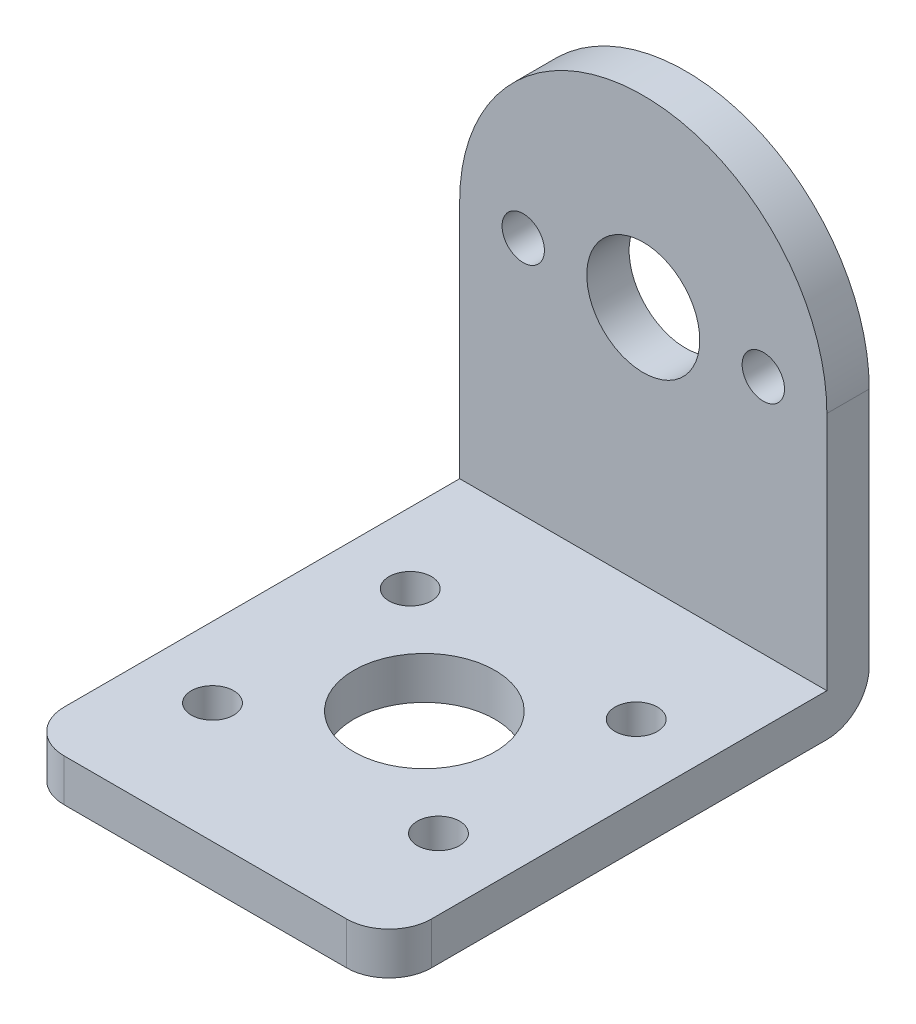
ISO-10303-21;
HEADER;
FILE_DESCRIPTION(('STEP AP214'),'2;1');
FILE_NAME('part.step','',(''),(''),'','','');
FILE_SCHEMA(('AUTOMOTIVE_DESIGN { 1 0 10303 214 1 1 1 1 }'));
ENDSEC;
DATA;
#1=APPLICATION_CONTEXT('core data for automotive mechanical design processes');
#2=APPLICATION_PROTOCOL_DEFINITION('international standard','automotive_design',2000,#1);
#3=PRODUCT_CONTEXT('',#1,'mechanical');
#4=PRODUCT('Part','Part','',(#3));
#5=PRODUCT_RELATED_PRODUCT_CATEGORY('part','',(#4));
#6=PRODUCT_DEFINITION_FORMATION('','',#4);
#7=PRODUCT_DEFINITION_CONTEXT('part definition',#1,'design');
#8=PRODUCT_DEFINITION('design','',#6,#7);
#9=PRODUCT_DEFINITION_SHAPE('','',#8);
#10=(LENGTH_UNIT() NAMED_UNIT(*) SI_UNIT(.MILLI.,.METRE.));
#11=(NAMED_UNIT(*) PLANE_ANGLE_UNIT() SI_UNIT($,.RADIAN.));
#12=(NAMED_UNIT(*) SI_UNIT($,.STERADIAN.) SOLID_ANGLE_UNIT());
#13=UNCERTAINTY_MEASURE_WITH_UNIT(LENGTH_MEASURE(1.E-05),#10,'distance_accuracy_value','');
#14=(GEOMETRIC_REPRESENTATION_CONTEXT(3) GLOBAL_UNCERTAINTY_ASSIGNED_CONTEXT((#13)) GLOBAL_UNIT_ASSIGNED_CONTEXT((#10,
#11,#12)) REPRESENTATION_CONTEXT('',''));
#15=CARTESIAN_POINT('',(0.,0.,0.));
#16=DIRECTION('',(0.,0.,1.));
#17=DIRECTION('',(1.,0.,0.));
#18=AXIS2_PLACEMENT_3D('',#15,#16,#17);
#19=CARTESIAN_POINT('',(0.,20.,3.));
#20=DIRECTION('',(0.,0.,1.));
#21=DIRECTION('',(1.,0.,0.));
#22=AXIS2_PLACEMENT_3D('',#19,#20,#21);
#23=PLANE('',#22);
#24=DIRECTION('',(-1.,0.,0.));
#25=VECTOR('',#24,1.);
#26=CARTESIAN_POINT('',(13.,3.,3.));
#27=LINE('',#26,#25);
#28=CARTESIAN_POINT('',(13.,3.,3.));
#29=VERTEX_POINT('',#28);
#30=CARTESIAN_POINT('',(-13.,3.,3.));
#31=VERTEX_POINT('',#30);
#32=EDGE_CURVE('E128',#29,#31,#27,.T.);
#33=ORIENTED_EDGE('',*,*,#32,.F.);
#34=DIRECTION('',(0.,1.,0.));
#35=VECTOR('',#34,1.);
#36=CARTESIAN_POINT('',(13.,0.,3.));
#37=LINE('',#36,#35);
#38=CARTESIAN_POINT('',(13.,20.,3.));
#39=VERTEX_POINT('',#38);
#40=EDGE_CURVE('E134',#29,#39,#37,.T.);
#41=ORIENTED_EDGE('',*,*,#40,.T.);
#42=CARTESIAN_POINT('',(0.,20.,3.));
#43=DIRECTION('',(0.,0.,1.));
#44=DIRECTION('',(1.,0.,0.));
#45=AXIS2_PLACEMENT_3D('',#42,#43,#44);
#46=CIRCLE('',#45,13.);
#47=CARTESIAN_POINT('',(-13.,20.,3.));
#48=VERTEX_POINT('',#47);
#49=EDGE_CURVE('E131',#39,#48,#46,.T.);
#50=ORIENTED_EDGE('',*,*,#49,.T.);
#51=DIRECTION('',(0.,-1.,0.));
#52=VECTOR('',#51,1.);
#53=CARTESIAN_POINT('',(-13.,20.,3.));
#54=LINE('',#53,#52);
#55=EDGE_CURVE('E114',#48,#31,#54,.T.);
#56=ORIENTED_EDGE('',*,*,#55,.T.);
#57=EDGE_LOOP('',(#33,#41,#50,#56));
#58=FACE_BOUND('',#57,.T.);
#59=CARTESIAN_POINT('',(-8.5,20.,3.));
#60=DIRECTION('',(0.,0.,1.));
#61=DIRECTION('',(1.,0.,0.));
#62=AXIS2_PLACEMENT_3D('',#59,#60,#61);
#63=CIRCLE('',#62,1.5);
#64=CARTESIAN_POINT('',(-7.,20.,3.));
#65=VERTEX_POINT('',#64);
#66=EDGE_CURVE('E163',#65,#65,#63,.T.);
#67=ORIENTED_EDGE('',*,*,#66,.F.);
#68=EDGE_LOOP('',(#67));
#69=FACE_BOUND('',#68,.T.);
#70=CARTESIAN_POINT('',(0.,20.,3.));
#71=DIRECTION('',(0.,0.,1.));
#72=DIRECTION('',(1.,0.,0.));
#73=AXIS2_PLACEMENT_3D('',#70,#71,#72);
#74=CIRCLE('',#73,4.);
#75=CARTESIAN_POINT('',(4.,20.,3.));
#76=VERTEX_POINT('',#75);
#77=EDGE_CURVE('E171',#76,#76,#74,.T.);
#78=ORIENTED_EDGE('',*,*,#77,.F.);
#79=EDGE_LOOP('',(#78));
#80=FACE_BOUND('',#79,.T.);
#81=CARTESIAN_POINT('',(8.5,20.,3.));
#82=DIRECTION('',(0.,0.,1.));
#83=DIRECTION('',(1.,0.,0.));
#84=AXIS2_PLACEMENT_3D('',#81,#82,#83);
#85=CIRCLE('',#84,1.5);
#86=CARTESIAN_POINT('',(10.,20.,3.));
#87=VERTEX_POINT('',#86);
#88=EDGE_CURVE('E155',#87,#87,#85,.T.);
#89=ORIENTED_EDGE('',*,*,#88,.F.);
#90=EDGE_LOOP('',(#89));
#91=FACE_BOUND('',#90,.T.);
#92=ADVANCED_FACE('F39',(#58,#69,#80,#91),#23,.T.);
#93=CARTESIAN_POINT('',(0.,20.,0.));
#94=DIRECTION('',(0.,0.,1.));
#95=DIRECTION('',(1.,0.,0.));
#96=AXIS2_PLACEMENT_3D('',#93,#94,#95);
#97=PLANE('',#96);
#98=DIRECTION('',(0.,1.,0.));
#99=VECTOR('',#98,1.);
#100=CARTESIAN_POINT('',(13.,0.,0.));
#101=LINE('',#100,#99);
#102=CARTESIAN_POINT('',(13.,3.,0.));
#103=VERTEX_POINT('',#102);
#104=CARTESIAN_POINT('',(13.,20.,0.));
#105=VERTEX_POINT('',#104);
#106=EDGE_CURVE('E186',#103,#105,#101,.T.);
#107=ORIENTED_EDGE('',*,*,#106,.F.);
#108=DIRECTION('',(1.,0.,0.));
#109=VECTOR('',#108,1.);
#110=CARTESIAN_POINT('',(0.,3.,0.));
#111=LINE('',#110,#109);
#112=CARTESIAN_POINT('',(-13.,3.00000000000001,0.));
#113=VERTEX_POINT('',#112);
#114=EDGE_CURVE('E48',#103,#113,#111,.F.);
#115=ORIENTED_EDGE('',*,*,#114,.T.);
#116=DIRECTION('',(0.,-1.,0.));
#117=VECTOR('',#116,1.);
#118=CARTESIAN_POINT('',(-13.,20.,0.));
#119=LINE('',#118,#117);
#120=CARTESIAN_POINT('',(-13.,20.,0.));
#121=VERTEX_POINT('',#120);
#122=EDGE_CURVE('E175',#121,#113,#119,.T.);
#123=ORIENTED_EDGE('',*,*,#122,.F.);
#124=CARTESIAN_POINT('',(0.,20.,0.));
#125=DIRECTION('',(0.,0.,1.));
#126=DIRECTION('',(1.,0.,0.));
#127=AXIS2_PLACEMENT_3D('',#124,#125,#126);
#128=CIRCLE('',#127,13.);
#129=EDGE_CURVE('E135',#105,#121,#128,.T.);
#130=ORIENTED_EDGE('',*,*,#129,.F.);
#131=EDGE_LOOP('',(#107,#115,#123,#130));
#132=FACE_BOUND('',#131,.T.);
#133=CARTESIAN_POINT('',(0.,20.,0.));
#134=DIRECTION('',(0.,0.,1.));
#135=DIRECTION('',(1.,0.,0.));
#136=AXIS2_PLACEMENT_3D('',#133,#134,#135);
#137=CIRCLE('',#136,4.);
#138=CARTESIAN_POINT('',(4.,20.,0.));
#139=VERTEX_POINT('',#138);
#140=EDGE_CURVE('E167',#139,#139,#137,.T.);
#141=ORIENTED_EDGE('',*,*,#140,.T.);
#142=EDGE_LOOP('',(#141));
#143=FACE_BOUND('',#142,.T.);
#144=CARTESIAN_POINT('',(-8.5,20.,0.));
#145=DIRECTION('',(0.,0.,1.));
#146=DIRECTION('',(1.,0.,0.));
#147=AXIS2_PLACEMENT_3D('',#144,#145,#146);
#148=CIRCLE('',#147,1.5);
#149=CARTESIAN_POINT('',(-7.,20.,0.));
#150=VERTEX_POINT('',#149);
#151=EDGE_CURVE('E159',#150,#150,#148,.T.);
#152=ORIENTED_EDGE('',*,*,#151,.T.);
#153=EDGE_LOOP('',(#152));
#154=FACE_BOUND('',#153,.T.);
#155=CARTESIAN_POINT('',(8.5,20.,0.));
#156=DIRECTION('',(0.,0.,1.));
#157=DIRECTION('',(1.,0.,0.));
#158=AXIS2_PLACEMENT_3D('',#155,#156,#157);
#159=CIRCLE('',#158,1.5);
#160=CARTESIAN_POINT('',(10.,20.,0.));
#161=VERTEX_POINT('',#160);
#162=EDGE_CURVE('E154',#161,#161,#159,.T.);
#163=ORIENTED_EDGE('',*,*,#162,.T.);
#164=EDGE_LOOP('',(#163));
#165=FACE_BOUND('',#164,.T.);
#166=ADVANCED_FACE('F264',(#132,#143,#154,#165),#97,.F.);
#167=CARTESIAN_POINT('',(-13.,20.,3.));
#168=DIRECTION('',(1.,0.,0.));
#169=DIRECTION('',(0.,1.,0.));
#170=AXIS2_PLACEMENT_3D('',#167,#168,#169);
#171=PLANE('',#170);
#172=ORIENTED_EDGE('',*,*,#122,.T.);
#173=CARTESIAN_POINT('',(-13.,3.,3.));
#174=DIRECTION('',(1.,0.,0.));
#175=DIRECTION('',(0.,1.,0.));
#176=AXIS2_PLACEMENT_3D('',#173,#174,#175);
#177=CIRCLE('',#176,3.);
#178=CARTESIAN_POINT('',(-13.,0.,3.));
#179=VERTEX_POINT('',#178);
#180=EDGE_CURVE('E11',#113,#179,#177,.F.);
#181=ORIENTED_EDGE('',*,*,#180,.T.);
#182=DIRECTION('',(0.,0.,-1.));
#183=VECTOR('',#182,1.);
#184=CARTESIAN_POINT('',(-13.,0.,3.));
#185=LINE('',#184,#183);
#186=CARTESIAN_POINT('',(-13.,0.,31.));
#187=VERTEX_POINT('',#186);
#188=EDGE_CURVE('E200',#187,#179,#185,.T.);
#189=ORIENTED_EDGE('',*,*,#188,.F.);
#190=DIRECTION('',(0.,-1.,0.));
#191=VECTOR('',#190,1.);
#192=CARTESIAN_POINT('',(-13.,3.,31.));
#193=LINE('',#192,#191);
#194=CARTESIAN_POINT('',(-13.,3.,31.));
#195=VERTEX_POINT('',#194);
#196=EDGE_CURVE('E117',#187,#195,#193,.F.);
#197=ORIENTED_EDGE('',*,*,#196,.T.);
#198=DIRECTION('',(0.,0.,-1.));
#199=VECTOR('',#198,1.);
#200=CARTESIAN_POINT('',(-13.,3.,34.));
#201=LINE('',#200,#199);
#202=EDGE_CURVE('E110',#195,#31,#201,.T.);
#203=ORIENTED_EDGE('',*,*,#202,.T.);
#204=ORIENTED_EDGE('',*,*,#55,.F.);
#205=DIRECTION('',(0.,0.,-1.));
#206=VECTOR('',#205,1.);
#207=CARTESIAN_POINT('',(-13.,20.,3.));
#208=LINE('',#207,#206);
#209=EDGE_CURVE('E183',#48,#121,#208,.T.);
#210=ORIENTED_EDGE('',*,*,#209,.T.);
#211=EDGE_LOOP('',(#172,#181,#189,#197,#203,#204,#210));
#212=FACE_BOUND('',#211,.T.);
#213=ADVANCED_FACE('F112',(#212),#171,.F.);
#214=CARTESIAN_POINT('',(-13.,0.,3.));
#215=DIRECTION('',(0.,1.,0.));
#216=DIRECTION('',(-1.,0.,0.));
#217=AXIS2_PLACEMENT_3D('',#214,#215,#216);
#218=PLANE('',#217);
#219=CARTESIAN_POINT('',(-8.,0.,25.5));
#220=DIRECTION('',(0.,1.,0.));
#221=DIRECTION('',(-1.,0.,0.));
#222=AXIS2_PLACEMENT_3D('',#219,#220,#221);
#223=CIRCLE('',#222,1.5);
#224=CARTESIAN_POINT('',(-9.5,0.,25.5));
#225=VERTEX_POINT('',#224);
#226=EDGE_CURVE('E439',#225,#225,#223,.T.);
#227=ORIENTED_EDGE('',*,*,#226,.T.);
#228=EDGE_LOOP('',(#227));
#229=FACE_BOUND('',#228,.T.);
#230=CARTESIAN_POINT('',(8.,0.,25.5));
#231=DIRECTION('',(0.,1.,0.));
#232=DIRECTION('',(-1.,0.,0.));
#233=AXIS2_PLACEMENT_3D('',#230,#231,#232);
#234=CIRCLE('',#233,1.5);
#235=CARTESIAN_POINT('',(6.5,0.,25.5));
#236=VERTEX_POINT('',#235);
#237=EDGE_CURVE('E473',#236,#236,#234,.T.);
#238=ORIENTED_EDGE('',*,*,#237,.T.);
#239=EDGE_LOOP('',(#238));
#240=FACE_BOUND('',#239,.T.);
#241=CARTESIAN_POINT('',(8.,0.,11.5));
#242=DIRECTION('',(0.,1.,0.));
#243=DIRECTION('',(-1.,0.,0.));
#244=AXIS2_PLACEMENT_3D('',#241,#242,#243);
#245=CIRCLE('',#244,1.5);
#246=CARTESIAN_POINT('',(6.5,0.,11.5));
#247=VERTEX_POINT('',#246);
#248=EDGE_CURVE('E463',#247,#247,#245,.T.);
#249=ORIENTED_EDGE('',*,*,#248,.T.);
#250=EDGE_LOOP('',(#249));
#251=FACE_BOUND('',#250,.T.);
#252=CARTESIAN_POINT('',(-8.,0.,11.5));
#253=DIRECTION('',(0.,1.,0.));
#254=DIRECTION('',(-1.,0.,0.));
#255=AXIS2_PLACEMENT_3D('',#252,#253,#254);
#256=CIRCLE('',#255,1.5);
#257=CARTESIAN_POINT('',(-9.5,0.,11.5));
#258=VERTEX_POINT('',#257);
#259=EDGE_CURVE('E452',#258,#258,#256,.T.);
#260=ORIENTED_EDGE('',*,*,#259,.T.);
#261=EDGE_LOOP('',(#260));
#262=FACE_BOUND('',#261,.T.);
#263=CARTESIAN_POINT('',(0.,0.,18.5));
#264=DIRECTION('',(0.,1.,0.));
#265=DIRECTION('',(-1.,0.,0.));
#266=AXIS2_PLACEMENT_3D('',#263,#264,#265);
#267=CIRCLE('',#266,5.);
#268=CARTESIAN_POINT('',(-5.,0.,18.5));
#269=VERTEX_POINT('',#268);
#270=EDGE_CURVE('E141',#269,#269,#267,.T.);
#271=ORIENTED_EDGE('',*,*,#270,.T.);
#272=EDGE_LOOP('',(#271));
#273=FACE_BOUND('',#272,.T.);
#274=ORIENTED_EDGE('',*,*,#188,.T.);
#275=DIRECTION('',(1.,0.,0.));
#276=VECTOR('',#275,1.);
#277=CARTESIAN_POINT('',(-13.,0.,3.));
#278=LINE('',#277,#276);
#279=CARTESIAN_POINT('',(13.,0.,3.));
#280=VERTEX_POINT('',#279);
#281=EDGE_CURVE('E229',#179,#280,#278,.T.);
#282=ORIENTED_EDGE('',*,*,#281,.T.);
#283=DIRECTION('',(0.,0.,-1.));
#284=VECTOR('',#283,1.);
#285=CARTESIAN_POINT('',(13.,0.,3.));
#286=LINE('',#285,#284);
#287=CARTESIAN_POINT('',(13.,0.,31.));
#288=VERTEX_POINT('',#287);
#289=EDGE_CURVE('E197',#288,#280,#286,.T.);
#290=ORIENTED_EDGE('',*,*,#289,.F.);
#291=CARTESIAN_POINT('',(10.,0.,31.));
#292=DIRECTION('',(0.,1.,0.));
#293=DIRECTION('',(-1.,0.,0.));
#294=AXIS2_PLACEMENT_3D('',#291,#292,#293);
#295=CIRCLE('',#294,3.);
#296=CARTESIAN_POINT('',(9.99999999999999,0.,34.));
#297=VERTEX_POINT('',#296);
#298=EDGE_CURVE('E212',#288,#297,#295,.F.);
#299=ORIENTED_EDGE('',*,*,#298,.T.);
#300=DIRECTION('',(1.,0.,0.));
#301=VECTOR('',#300,1.);
#302=CARTESIAN_POINT('',(-13.,0.,34.));
#303=LINE('',#302,#301);
#304=CARTESIAN_POINT('',(-10.,0.,34.));
#305=VERTEX_POINT('',#304);
#306=EDGE_CURVE('E140',#305,#297,#303,.T.);
#307=ORIENTED_EDGE('',*,*,#306,.F.);
#308=CARTESIAN_POINT('',(-10.,0.,31.));
#309=DIRECTION('',(0.,1.,0.));
#310=DIRECTION('',(-1.,0.,0.));
#311=AXIS2_PLACEMENT_3D('',#308,#309,#310);
#312=CIRCLE('',#311,3.);
#313=EDGE_CURVE('E215',#305,#187,#312,.F.);
#314=ORIENTED_EDGE('',*,*,#313,.T.);
#315=EDGE_LOOP('',(#274,#282,#290,#299,#307,#314));
#316=FACE_BOUND('',#315,.T.);
#317=ADVANCED_FACE('F246',(#229,#240,#251,#262,#273,#316),#218,.F.);
#318=CARTESIAN_POINT('',(13.,0.,3.));
#319=DIRECTION('',(-1.,0.,0.));
#320=DIRECTION('',(0.,-1.,0.));
#321=AXIS2_PLACEMENT_3D('',#318,#319,#320);
#322=PLANE('',#321);
#323=ORIENTED_EDGE('',*,*,#289,.T.);
#324=CARTESIAN_POINT('',(13.,3.,3.));
#325=DIRECTION('',(-1.,0.,0.));
#326=DIRECTION('',(0.,-1.,0.));
#327=AXIS2_PLACEMENT_3D('',#324,#325,#326);
#328=CIRCLE('',#327,3.);
#329=EDGE_CURVE('E62',#280,#103,#328,.F.);
#330=ORIENTED_EDGE('',*,*,#329,.T.);
#331=ORIENTED_EDGE('',*,*,#106,.T.);
#332=DIRECTION('',(0.,0.,-1.));
#333=VECTOR('',#332,1.);
#334=CARTESIAN_POINT('',(13.,20.,3.));
#335=LINE('',#334,#333);
#336=EDGE_CURVE('E193',#39,#105,#335,.T.);
#337=ORIENTED_EDGE('',*,*,#336,.F.);
#338=ORIENTED_EDGE('',*,*,#40,.F.);
#339=DIRECTION('',(0.,0.,-1.));
#340=VECTOR('',#339,1.);
#341=CARTESIAN_POINT('',(13.,3.,34.));
#342=LINE('',#341,#340);
#343=CARTESIAN_POINT('',(13.,3.,31.));
#344=VERTEX_POINT('',#343);
#345=EDGE_CURVE('E122',#344,#29,#342,.T.);
#346=ORIENTED_EDGE('',*,*,#345,.F.);
#347=DIRECTION('',(0.,1.,0.));
#348=VECTOR('',#347,1.);
#349=CARTESIAN_POINT('',(13.,0.,31.));
#350=LINE('',#349,#348);
#351=EDGE_CURVE('E226',#344,#288,#350,.F.);
#352=ORIENTED_EDGE('',*,*,#351,.T.);
#353=EDGE_LOOP('',(#323,#330,#331,#337,#338,#346,#352));
#354=FACE_BOUND('',#353,.T.);
#355=ADVANCED_FACE('F252',(#354),#322,.F.);
#356=CARTESIAN_POINT('',(0.,20.,3.));
#357=DIRECTION('',(0.,0.,-1.));
#358=DIRECTION('',(-1.,0.,0.));
#359=AXIS2_PLACEMENT_3D('',#356,#357,#358);
#360=CYLINDRICAL_SURFACE('',#359,13.);
#361=ORIENTED_EDGE('',*,*,#129,.T.);
#362=ORIENTED_EDGE('',*,*,#209,.F.);
#363=ORIENTED_EDGE('',*,*,#49,.F.);
#364=ORIENTED_EDGE('',*,*,#336,.T.);
#365=EDGE_LOOP('',(#361,#362,#363,#364));
#366=FACE_BOUND('',#365,.T.);
#367=ADVANCED_FACE('F274',(#366),#360,.T.);
#368=CARTESIAN_POINT('',(0.,20.,3.));
#369=DIRECTION('',(0.,0.,-1.));
#370=DIRECTION('',(-1.,0.,0.));
#371=AXIS2_PLACEMENT_3D('',#368,#369,#370);
#372=CYLINDRICAL_SURFACE('',#371,4.);
#373=ORIENTED_EDGE('',*,*,#77,.T.);
#374=EDGE_LOOP('',(#373));
#375=FACE_BOUND('',#374,.T.);
#376=ORIENTED_EDGE('',*,*,#140,.F.);
#377=EDGE_LOOP('',(#376));
#378=FACE_BOUND('',#377,.T.);
#379=ADVANCED_FACE('F271',(#375,#378),#372,.F.);
#380=CARTESIAN_POINT('',(-8.5,20.,3.));
#381=DIRECTION('',(0.,0.,-1.));
#382=DIRECTION('',(-1.,0.,0.));
#383=AXIS2_PLACEMENT_3D('',#380,#381,#382);
#384=CYLINDRICAL_SURFACE('',#383,1.5);
#385=ORIENTED_EDGE('',*,*,#66,.T.);
#386=EDGE_LOOP('',(#385));
#387=FACE_BOUND('',#386,.T.);
#388=ORIENTED_EDGE('',*,*,#151,.F.);
#389=EDGE_LOOP('',(#388));
#390=FACE_BOUND('',#389,.T.);
#391=ADVANCED_FACE('F307',(#387,#390),#384,.F.);
#392=CARTESIAN_POINT('',(8.5,20.,3.));
#393=DIRECTION('',(0.,0.,-1.));
#394=DIRECTION('',(-1.,0.,0.));
#395=AXIS2_PLACEMENT_3D('',#392,#393,#394);
#396=CYLINDRICAL_SURFACE('',#395,1.5);
#397=ORIENTED_EDGE('',*,*,#88,.T.);
#398=EDGE_LOOP('',(#397));
#399=FACE_BOUND('',#398,.T.);
#400=ORIENTED_EDGE('',*,*,#162,.F.);
#401=EDGE_LOOP('',(#400));
#402=FACE_BOUND('',#401,.T.);
#403=ADVANCED_FACE('F314',(#399,#402),#396,.F.);
#404=CARTESIAN_POINT('',(13.,3.,34.));
#405=DIRECTION('',(0.,-1.,0.));
#406=DIRECTION('',(1.,0.,0.));
#407=AXIS2_PLACEMENT_3D('',#404,#405,#406);
#408=PLANE('',#407);
#409=CARTESIAN_POINT('',(-8.,3.,25.5));
#410=DIRECTION('',(0.,1.,0.));
#411=DIRECTION('',(-1.,0.,0.));
#412=AXIS2_PLACEMENT_3D('',#409,#410,#411);
#413=CIRCLE('',#412,1.5);
#414=CARTESIAN_POINT('',(-9.5,3.,25.5));
#415=VERTEX_POINT('',#414);
#416=EDGE_CURVE('E442',#415,#415,#413,.T.);
#417=ORIENTED_EDGE('',*,*,#416,.F.);
#418=EDGE_LOOP('',(#417));
#419=FACE_BOUND('',#418,.T.);
#420=CARTESIAN_POINT('',(8.,3.,25.5));
#421=DIRECTION('',(0.,1.,0.));
#422=DIRECTION('',(-1.,0.,0.));
#423=AXIS2_PLACEMENT_3D('',#420,#421,#422);
#424=CIRCLE('',#423,1.5);
#425=CARTESIAN_POINT('',(6.5,3.,25.5));
#426=VERTEX_POINT('',#425);
#427=EDGE_CURVE('E446',#426,#426,#424,.T.);
#428=ORIENTED_EDGE('',*,*,#427,.F.);
#429=EDGE_LOOP('',(#428));
#430=FACE_BOUND('',#429,.T.);
#431=CARTESIAN_POINT('',(8.,3.,11.5));
#432=DIRECTION('',(0.,1.,0.));
#433=DIRECTION('',(-1.,0.,0.));
#434=AXIS2_PLACEMENT_3D('',#431,#432,#433);
#435=CIRCLE('',#434,1.5);
#436=CARTESIAN_POINT('',(6.5,3.,11.5));
#437=VERTEX_POINT('',#436);
#438=EDGE_CURVE('E469',#437,#437,#435,.T.);
#439=ORIENTED_EDGE('',*,*,#438,.F.);
#440=EDGE_LOOP('',(#439));
#441=FACE_BOUND('',#440,.T.);
#442=CARTESIAN_POINT('',(-8.,3.,11.5));
#443=DIRECTION('',(0.,1.,0.));
#444=DIRECTION('',(-1.,0.,0.));
#445=AXIS2_PLACEMENT_3D('',#442,#443,#444);
#446=CIRCLE('',#445,1.5);
#447=CARTESIAN_POINT('',(-9.5,3.,11.5));
#448=VERTEX_POINT('',#447);
#449=EDGE_CURVE('E457',#448,#448,#446,.T.);
#450=ORIENTED_EDGE('',*,*,#449,.F.);
#451=EDGE_LOOP('',(#450));
#452=FACE_BOUND('',#451,.T.);
#453=CARTESIAN_POINT('',(0.,3.,18.5));
#454=DIRECTION('',(0.,1.,0.));
#455=DIRECTION('',(-1.,0.,0.));
#456=AXIS2_PLACEMENT_3D('',#453,#454,#455);
#457=CIRCLE('',#456,5.);
#458=CARTESIAN_POINT('',(-5.,3.,18.5));
#459=VERTEX_POINT('',#458);
#460=EDGE_CURVE('E148',#459,#459,#457,.T.);
#461=ORIENTED_EDGE('',*,*,#460,.F.);
#462=EDGE_LOOP('',(#461));
#463=FACE_BOUND('',#462,.T.);
#464=ORIENTED_EDGE('',*,*,#202,.F.);
#465=CARTESIAN_POINT('',(-10.,3.,31.));
#466=DIRECTION('',(0.,-1.,0.));
#467=DIRECTION('',(1.,0.,0.));
#468=AXIS2_PLACEMENT_3D('',#465,#466,#467);
#469=CIRCLE('',#468,3.);
#470=CARTESIAN_POINT('',(-10.,3.,34.));
#471=VERTEX_POINT('',#470);
#472=EDGE_CURVE('E223',#195,#471,#469,.F.);
#473=ORIENTED_EDGE('',*,*,#472,.T.);
#474=DIRECTION('',(-1.,0.,0.));
#475=VECTOR('',#474,1.);
#476=CARTESIAN_POINT('',(13.,3.,34.));
#477=LINE('',#476,#475);
#478=CARTESIAN_POINT('',(10.,3.,34.));
#479=VERTEX_POINT('',#478);
#480=EDGE_CURVE('E123',#479,#471,#477,.T.);
#481=ORIENTED_EDGE('',*,*,#480,.F.);
#482=CARTESIAN_POINT('',(10.,3.,31.));
#483=DIRECTION('',(0.,-1.,0.));
#484=DIRECTION('',(1.,0.,0.));
#485=AXIS2_PLACEMENT_3D('',#482,#483,#484);
#486=CIRCLE('',#485,3.);
#487=EDGE_CURVE('E220',#479,#344,#486,.F.);
#488=ORIENTED_EDGE('',*,*,#487,.T.);
#489=ORIENTED_EDGE('',*,*,#345,.T.);
#490=ORIENTED_EDGE('',*,*,#32,.T.);
#491=EDGE_LOOP('',(#464,#473,#481,#488,#489,#490));
#492=FACE_BOUND('',#491,.T.);
#493=ADVANCED_FACE('F137',(#419,#430,#441,#452,#463,#492),#408,.F.);
#494=CARTESIAN_POINT('',(0.,0.,34.));
#495=DIRECTION('',(0.,0.,1.));
#496=DIRECTION('',(1.,0.,0.));
#497=AXIS2_PLACEMENT_3D('',#494,#495,#496);
#498=PLANE('',#497);
#499=ORIENTED_EDGE('',*,*,#480,.T.);
#500=DIRECTION('',(0.,-1.,0.));
#501=VECTOR('',#500,1.);
#502=CARTESIAN_POINT('',(-10.,0.,34.));
#503=LINE('',#502,#501);
#504=EDGE_CURVE('E208',#471,#305,#503,.T.);
#505=ORIENTED_EDGE('',*,*,#504,.T.);
#506=ORIENTED_EDGE('',*,*,#306,.T.);
#507=DIRECTION('',(0.,1.,0.));
#508=VECTOR('',#507,1.);
#509=CARTESIAN_POINT('',(10.,3.,34.));
#510=LINE('',#509,#508);
#511=EDGE_CURVE('E204',#297,#479,#510,.T.);
#512=ORIENTED_EDGE('',*,*,#511,.T.);
#513=EDGE_LOOP('',(#499,#505,#506,#512));
#514=FACE_BOUND('',#513,.T.);
#515=ADVANCED_FACE('F240',(#514),#498,.T.);
#516=CARTESIAN_POINT('',(0.,0.,18.5));
#517=DIRECTION('',(0.,1.,0.));
#518=DIRECTION('',(-1.,0.,0.));
#519=AXIS2_PLACEMENT_3D('',#516,#517,#518);
#520=CYLINDRICAL_SURFACE('',#519,5.);
#521=ORIENTED_EDGE('',*,*,#270,.F.);
#522=EDGE_LOOP('',(#521));
#523=FACE_BOUND('',#522,.T.);
#524=ORIENTED_EDGE('',*,*,#460,.T.);
#525=EDGE_LOOP('',(#524));
#526=FACE_BOUND('',#525,.T.);
#527=ADVANCED_FACE('F336',(#523,#526),#520,.F.);
#528=CARTESIAN_POINT('',(-8.,0.,11.5));
#529=DIRECTION('',(0.,1.,0.));
#530=DIRECTION('',(-1.,0.,0.));
#531=AXIS2_PLACEMENT_3D('',#528,#529,#530);
#532=CYLINDRICAL_SURFACE('',#531,1.5);
#533=ORIENTED_EDGE('',*,*,#259,.F.);
#534=EDGE_LOOP('',(#533));
#535=FACE_BOUND('',#534,.T.);
#536=ORIENTED_EDGE('',*,*,#449,.T.);
#537=EDGE_LOOP('',(#536));
#538=FACE_BOUND('',#537,.T.);
#539=ADVANCED_FACE('F344',(#535,#538),#532,.F.);
#540=CARTESIAN_POINT('',(8.,0.,11.5));
#541=DIRECTION('',(0.,1.,0.));
#542=DIRECTION('',(-1.,0.,0.));
#543=AXIS2_PLACEMENT_3D('',#540,#541,#542);
#544=CYLINDRICAL_SURFACE('',#543,1.5);
#545=ORIENTED_EDGE('',*,*,#248,.F.);
#546=EDGE_LOOP('',(#545));
#547=FACE_BOUND('',#546,.T.);
#548=ORIENTED_EDGE('',*,*,#438,.T.);
#549=EDGE_LOOP('',(#548));
#550=FACE_BOUND('',#549,.T.);
#551=ADVANCED_FACE('F352',(#547,#550),#544,.F.);
#552=CARTESIAN_POINT('',(8.,0.,25.5));
#553=DIRECTION('',(0.,1.,0.));
#554=DIRECTION('',(-1.,0.,0.));
#555=AXIS2_PLACEMENT_3D('',#552,#553,#554);
#556=CYLINDRICAL_SURFACE('',#555,1.5);
#557=ORIENTED_EDGE('',*,*,#237,.F.);
#558=EDGE_LOOP('',(#557));
#559=FACE_BOUND('',#558,.T.);
#560=ORIENTED_EDGE('',*,*,#427,.T.);
#561=EDGE_LOOP('',(#560));
#562=FACE_BOUND('',#561,.T.);
#563=ADVANCED_FACE('F360',(#559,#562),#556,.F.);
#564=CARTESIAN_POINT('',(-8.,0.,25.5));
#565=DIRECTION('',(0.,1.,0.));
#566=DIRECTION('',(-1.,0.,0.));
#567=AXIS2_PLACEMENT_3D('',#564,#565,#566);
#568=CYLINDRICAL_SURFACE('',#567,1.5);
#569=ORIENTED_EDGE('',*,*,#226,.F.);
#570=EDGE_LOOP('',(#569));
#571=FACE_BOUND('',#570,.T.);
#572=ORIENTED_EDGE('',*,*,#416,.T.);
#573=EDGE_LOOP('',(#572));
#574=FACE_BOUND('',#573,.T.);
#575=ADVANCED_FACE('F261',(#571,#574),#568,.F.);
#576=CARTESIAN_POINT('',(-10.,0.,31.));
#577=DIRECTION('',(0.,1.,0.));
#578=DIRECTION('',(-1.,0.,0.));
#579=AXIS2_PLACEMENT_3D('',#576,#577,#578);
#580=CYLINDRICAL_SURFACE('',#579,3.);
#581=ORIENTED_EDGE('',*,*,#472,.F.);
#582=ORIENTED_EDGE('',*,*,#196,.F.);
#583=ORIENTED_EDGE('',*,*,#313,.F.);
#584=ORIENTED_EDGE('',*,*,#504,.F.);
#585=EDGE_LOOP('',(#581,#582,#583,#584));
#586=FACE_BOUND('',#585,.T.);
#587=ADVANCED_FACE('F244',(#586),#580,.T.);
#588=CARTESIAN_POINT('',(10.,0.,31.));
#589=DIRECTION('',(0.,-1.,0.));
#590=DIRECTION('',(1.,0.,0.));
#591=AXIS2_PLACEMENT_3D('',#588,#589,#590);
#592=CYLINDRICAL_SURFACE('',#591,3.);
#593=ORIENTED_EDGE('',*,*,#298,.F.);
#594=ORIENTED_EDGE('',*,*,#351,.F.);
#595=ORIENTED_EDGE('',*,*,#487,.F.);
#596=ORIENTED_EDGE('',*,*,#511,.F.);
#597=EDGE_LOOP('',(#593,#594,#595,#596));
#598=FACE_BOUND('',#597,.T.);
#599=ADVANCED_FACE('F255',(#598),#592,.T.);
#600=CARTESIAN_POINT('',(-13.,3.,3.));
#601=DIRECTION('',(1.,0.,0.));
#602=DIRECTION('',(0.,1.,0.));
#603=AXIS2_PLACEMENT_3D('',#600,#601,#602);
#604=CYLINDRICAL_SURFACE('',#603,3.);
#605=ORIENTED_EDGE('',*,*,#180,.F.);
#606=ORIENTED_EDGE('',*,*,#114,.F.);
#607=ORIENTED_EDGE('',*,*,#329,.F.);
#608=ORIENTED_EDGE('',*,*,#281,.F.);
#609=EDGE_LOOP('',(#605,#606,#607,#608));
#610=FACE_BOUND('',#609,.T.);
#611=ADVANCED_FACE('F41',(#610),#604,.T.);
#612=CLOSED_SHELL('',(#92,#166,#213,#317,#355,#367,#379,#391,#403,#493,#515,#527,#539,#551,#563,
#575,#587,#599,#611));
#613=MANIFOLD_SOLID_BREP('B2',#612);
#614=ADVANCED_BREP_SHAPE_REPRESENTATION('',(#18,#613),#14);
#615=SHAPE_DEFINITION_REPRESENTATION(#9,#614);
ENDSEC;
END-ISO-10303-21;
